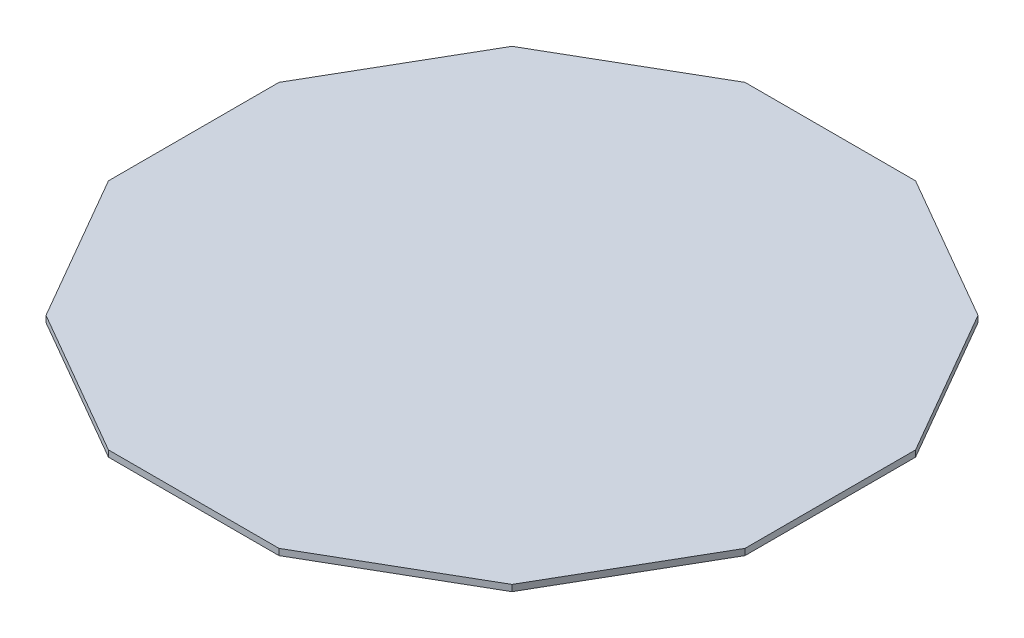
ISO-10303-21;
HEADER;
FILE_DESCRIPTION(('STEP AP214'),'2;1');
FILE_NAME('part.step','',(''),(''),'','','');
FILE_SCHEMA(('AUTOMOTIVE_DESIGN { 1 0 10303 214 1 1 1 1 }'));
ENDSEC;
DATA;
#1=APPLICATION_CONTEXT('core data for automotive mechanical design processes');
#2=APPLICATION_PROTOCOL_DEFINITION('international standard','automotive_design',2000,#1);
#3=PRODUCT_CONTEXT('',#1,'mechanical');
#4=PRODUCT('Part','Part','',(#3));
#5=PRODUCT_RELATED_PRODUCT_CATEGORY('part','',(#4));
#6=PRODUCT_DEFINITION_FORMATION('','',#4);
#7=PRODUCT_DEFINITION_CONTEXT('part definition',#1,'design');
#8=PRODUCT_DEFINITION('design','',#6,#7);
#9=PRODUCT_DEFINITION_SHAPE('','',#8);
#10=(LENGTH_UNIT() NAMED_UNIT(*) SI_UNIT(.MILLI.,.METRE.));
#11=(NAMED_UNIT(*) PLANE_ANGLE_UNIT() SI_UNIT($,.RADIAN.));
#12=(NAMED_UNIT(*) SI_UNIT($,.STERADIAN.) SOLID_ANGLE_UNIT());
#13=UNCERTAINTY_MEASURE_WITH_UNIT(LENGTH_MEASURE(1.E-05),#10,'distance_accuracy_value','');
#14=(GEOMETRIC_REPRESENTATION_CONTEXT(3) GLOBAL_UNCERTAINTY_ASSIGNED_CONTEXT((#13)) GLOBAL_UNIT_ASSIGNED_CONTEXT((#10,
#11,#12)) REPRESENTATION_CONTEXT('',''));
#15=CARTESIAN_POINT('',(0.,0.,0.));
#16=DIRECTION('',(0.,0.,1.));
#17=DIRECTION('',(1.,0.,0.));
#18=AXIS2_PLACEMENT_3D('',#15,#16,#17);
#19=CARTESIAN_POINT('',(127.485084689642,-2.921,-73.6035479632271));
#20=DIRECTION('',(0.866025403784439,0.,-0.5));
#21=DIRECTION('',(-0.5,0.,-0.866025403784439));
#22=AXIS2_PLACEMENT_3D('',#19,#20,#21);
#23=PLANE('',#22);
#24=DIRECTION('',(-0.5,0.,-0.866025403784439));
#25=VECTOR('',#24,1.);
#26=CARTESIAN_POINT('',(127.485084689642,0.,-73.6035479632271));
#27=LINE('',#26,#25);
#28=CARTESIAN_POINT('',(147.207095926454,0.,-39.4440224736242));
#29=VERTEX_POINT('',#28);
#30=CARTESIAN_POINT('',(107.76307345283,0.,-107.76307345283));
#31=VERTEX_POINT('',#30);
#32=EDGE_CURVE('E159',#29,#31,#27,.T.);
#33=ORIENTED_EDGE('',*,*,#32,.F.);
#34=DIRECTION('',(0.,1.,0.));
#35=VECTOR('',#34,1.);
#36=CARTESIAN_POINT('',(147.207095926454,-2.921,-39.4440224736242));
#37=LINE('',#36,#35);
#38=CARTESIAN_POINT('',(147.207095926454,-2.921,-39.4440224736242));
#39=VERTEX_POINT('',#38);
#40=EDGE_CURVE('E11',#39,#29,#37,.T.);
#41=ORIENTED_EDGE('',*,*,#40,.F.);
#42=DIRECTION('',(-0.5,0.,-0.866025403784439));
#43=VECTOR('',#42,1.);
#44=CARTESIAN_POINT('',(127.485084689642,-2.921,-73.6035479632271));
#45=LINE('',#44,#43);
#46=CARTESIAN_POINT('',(107.76307345283,-2.921,-107.76307345283));
#47=VERTEX_POINT('',#46);
#48=EDGE_CURVE('E191',#39,#47,#45,.T.);
#49=ORIENTED_EDGE('',*,*,#48,.T.);
#50=DIRECTION('',(0.,1.,0.));
#51=VECTOR('',#50,1.);
#52=CARTESIAN_POINT('',(107.76307345283,-2.921,-107.76307345283));
#53=LINE('',#52,#51);
#54=EDGE_CURVE('E41',#47,#31,#53,.T.);
#55=ORIENTED_EDGE('',*,*,#54,.T.);
#56=EDGE_LOOP('',(#33,#41,#49,#55));
#57=FACE_BOUND('',#56,.T.);
#58=ADVANCED_FACE('F38',(#57),#23,.T.);
#59=CARTESIAN_POINT('',(147.207095926454,-2.921,0.));
#60=DIRECTION('',(1.,0.,0.));
#61=DIRECTION('',(0.,0.,-1.));
#62=AXIS2_PLACEMENT_3D('',#59,#60,#61);
#63=PLANE('',#62);
#64=DIRECTION('',(0.,0.,-1.));
#65=VECTOR('',#64,1.);
#66=CARTESIAN_POINT('',(147.207095926454,0.,0.));
#67=LINE('',#66,#65);
#68=CARTESIAN_POINT('',(147.207095926454,0.,39.4440224736242));
#69=VERTEX_POINT('',#68);
#70=EDGE_CURVE('E189',#69,#29,#67,.T.);
#71=ORIENTED_EDGE('',*,*,#70,.F.);
#72=DIRECTION('',(0.,1.,0.));
#73=VECTOR('',#72,1.);
#74=CARTESIAN_POINT('',(147.207095926454,-2.921,39.4440224736242));
#75=LINE('',#74,#73);
#76=CARTESIAN_POINT('',(147.207095926454,-2.921,39.4440224736242));
#77=VERTEX_POINT('',#76);
#78=EDGE_CURVE('E47',#77,#69,#75,.T.);
#79=ORIENTED_EDGE('',*,*,#78,.F.);
#80=DIRECTION('',(0.,0.,-1.));
#81=VECTOR('',#80,1.);
#82=CARTESIAN_POINT('',(147.207095926454,-2.921,0.));
#83=LINE('',#82,#81);
#84=EDGE_CURVE('E149',#77,#39,#83,.T.);
#85=ORIENTED_EDGE('',*,*,#84,.T.);
#86=ORIENTED_EDGE('',*,*,#40,.T.);
#87=EDGE_LOOP('',(#71,#79,#85,#86));
#88=FACE_BOUND('',#87,.T.);
#89=ADVANCED_FACE('F211',(#88),#63,.T.);
#90=CARTESIAN_POINT('',(127.485084689642,-2.921,73.6035479632271));
#91=DIRECTION('',(0.866025403784439,0.,0.5));
#92=DIRECTION('',(0.5,0.,-0.866025403784439));
#93=AXIS2_PLACEMENT_3D('',#90,#91,#92);
#94=PLANE('',#93);
#95=DIRECTION('',(0.5,0.,-0.866025403784439));
#96=VECTOR('',#95,1.);
#97=CARTESIAN_POINT('',(127.485084689642,0.,73.6035479632271));
#98=LINE('',#97,#96);
#99=CARTESIAN_POINT('',(107.76307345283,0.,107.76307345283));
#100=VERTEX_POINT('',#99);
#101=EDGE_CURVE('E136',#100,#69,#98,.T.);
#102=ORIENTED_EDGE('',*,*,#101,.F.);
#103=DIRECTION('',(0.,1.,0.));
#104=VECTOR('',#103,1.);
#105=CARTESIAN_POINT('',(107.76307345283,-2.921,107.76307345283));
#106=LINE('',#105,#104);
#107=CARTESIAN_POINT('',(107.76307345283,-2.921,107.76307345283));
#108=VERTEX_POINT('',#107);
#109=EDGE_CURVE('E131',#108,#100,#106,.T.);
#110=ORIENTED_EDGE('',*,*,#109,.F.);
#111=DIRECTION('',(0.5,0.,-0.866025403784439));
#112=VECTOR('',#111,1.);
#113=CARTESIAN_POINT('',(127.485084689642,-2.921,73.6035479632271));
#114=LINE('',#113,#112);
#115=EDGE_CURVE('E134',#108,#77,#114,.T.);
#116=ORIENTED_EDGE('',*,*,#115,.T.);
#117=ORIENTED_EDGE('',*,*,#78,.T.);
#118=EDGE_LOOP('',(#102,#110,#116,#117));
#119=FACE_BOUND('',#118,.T.);
#120=ADVANCED_FACE('F133',(#119),#94,.T.);
#121=CARTESIAN_POINT('',(73.603547963227,-2.921,127.485084689642));
#122=DIRECTION('',(0.5,0.,0.866025403784439));
#123=DIRECTION('',(0.866025403784439,0.,-0.5));
#124=AXIS2_PLACEMENT_3D('',#121,#122,#123);
#125=PLANE('',#124);
#126=DIRECTION('',(0.866025403784439,0.,-0.5));
#127=VECTOR('',#126,1.);
#128=CARTESIAN_POINT('',(73.603547963227,0.,127.485084689642));
#129=LINE('',#128,#127);
#130=CARTESIAN_POINT('',(39.4440224736242,0.,147.207095926454));
#131=VERTEX_POINT('',#130);
#132=EDGE_CURVE('E186',#131,#100,#129,.T.);
#133=ORIENTED_EDGE('',*,*,#132,.F.);
#134=DIRECTION('',(0.,1.,0.));
#135=VECTOR('',#134,1.);
#136=CARTESIAN_POINT('',(39.4440224736242,-2.921,147.207095926454));
#137=LINE('',#136,#135);
#138=CARTESIAN_POINT('',(39.4440224736242,-2.921,147.207095926454));
#139=VERTEX_POINT('',#138);
#140=EDGE_CURVE('E141',#139,#131,#137,.T.);
#141=ORIENTED_EDGE('',*,*,#140,.F.);
#142=DIRECTION('',(0.866025403784439,0.,-0.5));
#143=VECTOR('',#142,1.);
#144=CARTESIAN_POINT('',(73.603547963227,-2.921,127.485084689642));
#145=LINE('',#144,#143);
#146=EDGE_CURVE('E147',#139,#108,#145,.T.);
#147=ORIENTED_EDGE('',*,*,#146,.T.);
#148=ORIENTED_EDGE('',*,*,#109,.T.);
#149=EDGE_LOOP('',(#133,#141,#147,#148));
#150=FACE_BOUND('',#149,.T.);
#151=ADVANCED_FACE('F151',(#150),#125,.T.);
#152=CARTESIAN_POINT('',(0.,-2.921,147.207095926454));
#153=DIRECTION('',(0.,0.,1.));
#154=DIRECTION('',(1.,0.,0.));
#155=AXIS2_PLACEMENT_3D('',#152,#153,#154);
#156=PLANE('',#155);
#157=DIRECTION('',(1.,0.,0.));
#158=VECTOR('',#157,1.);
#159=CARTESIAN_POINT('',(0.,0.,147.207095926454));
#160=LINE('',#159,#158);
#161=CARTESIAN_POINT('',(-39.4440224736242,0.,147.207095926454));
#162=VERTEX_POINT('',#161);
#163=EDGE_CURVE('E183',#162,#131,#160,.T.);
#164=ORIENTED_EDGE('',*,*,#163,.F.);
#165=DIRECTION('',(0.,1.,0.));
#166=VECTOR('',#165,1.);
#167=CARTESIAN_POINT('',(-39.4440224736242,-2.921,147.207095926454));
#168=LINE('',#167,#166);
#169=CARTESIAN_POINT('',(-39.4440224736242,-2.921,147.207095926454));
#170=VERTEX_POINT('',#169);
#171=EDGE_CURVE('E195',#170,#162,#168,.T.);
#172=ORIENTED_EDGE('',*,*,#171,.F.);
#173=DIRECTION('',(1.,0.,0.));
#174=VECTOR('',#173,1.);
#175=CARTESIAN_POINT('',(0.,-2.921,147.207095926454));
#176=LINE('',#175,#174);
#177=EDGE_CURVE('E152',#170,#139,#176,.T.);
#178=ORIENTED_EDGE('',*,*,#177,.T.);
#179=ORIENTED_EDGE('',*,*,#140,.T.);
#180=EDGE_LOOP('',(#164,#172,#178,#179));
#181=FACE_BOUND('',#180,.T.);
#182=ADVANCED_FACE('F224',(#181),#156,.T.);
#183=CARTESIAN_POINT('',(-73.603547963227,-2.921,127.485084689642));
#184=DIRECTION('',(-0.5,0.,0.866025403784439));
#185=DIRECTION('',(0.866025403784439,0.,0.5));
#186=AXIS2_PLACEMENT_3D('',#183,#184,#185);
#187=PLANE('',#186);
#188=DIRECTION('',(0.866025403784439,0.,0.5));
#189=VECTOR('',#188,1.);
#190=CARTESIAN_POINT('',(-73.603547963227,0.,127.485084689642));
#191=LINE('',#190,#189);
#192=CARTESIAN_POINT('',(-107.76307345283,0.,107.76307345283));
#193=VERTEX_POINT('',#192);
#194=EDGE_CURVE('E180',#193,#162,#191,.T.);
#195=ORIENTED_EDGE('',*,*,#194,.F.);
#196=DIRECTION('',(0.,1.,0.));
#197=VECTOR('',#196,1.);
#198=CARTESIAN_POINT('',(-107.76307345283,-2.921,107.76307345283));
#199=LINE('',#198,#197);
#200=CARTESIAN_POINT('',(-107.76307345283,-2.921,107.76307345283));
#201=VERTEX_POINT('',#200);
#202=EDGE_CURVE('E197',#201,#193,#199,.T.);
#203=ORIENTED_EDGE('',*,*,#202,.F.);
#204=DIRECTION('',(0.866025403784439,0.,0.5));
#205=VECTOR('',#204,1.);
#206=CARTESIAN_POINT('',(-73.603547963227,-2.921,127.485084689642));
#207=LINE('',#206,#205);
#208=EDGE_CURVE('E154',#201,#170,#207,.T.);
#209=ORIENTED_EDGE('',*,*,#208,.T.);
#210=ORIENTED_EDGE('',*,*,#171,.T.);
#211=EDGE_LOOP('',(#195,#203,#209,#210));
#212=FACE_BOUND('',#211,.T.);
#213=ADVANCED_FACE('F227',(#212),#187,.T.);
#214=CARTESIAN_POINT('',(-127.485084689642,-2.921,73.6035479632271));
#215=DIRECTION('',(-0.866025403784439,0.,0.5));
#216=DIRECTION('',(0.5,0.,0.866025403784439));
#217=AXIS2_PLACEMENT_3D('',#214,#215,#216);
#218=PLANE('',#217);
#219=DIRECTION('',(0.5,0.,0.866025403784439));
#220=VECTOR('',#219,1.);
#221=CARTESIAN_POINT('',(-127.485084689642,0.,73.6035479632271));
#222=LINE('',#221,#220);
#223=CARTESIAN_POINT('',(-147.207095926454,0.,39.4440224736242));
#224=VERTEX_POINT('',#223);
#225=EDGE_CURVE('E177',#224,#193,#222,.T.);
#226=ORIENTED_EDGE('',*,*,#225,.F.);
#227=DIRECTION('',(0.,1.,0.));
#228=VECTOR('',#227,1.);
#229=CARTESIAN_POINT('',(-147.207095926454,-2.921,39.4440224736242));
#230=LINE('',#229,#228);
#231=CARTESIAN_POINT('',(-147.207095926454,-2.921,39.4440224736242));
#232=VERTEX_POINT('',#231);
#233=EDGE_CURVE('E199',#232,#224,#230,.T.);
#234=ORIENTED_EDGE('',*,*,#233,.F.);
#235=DIRECTION('',(0.5,0.,0.866025403784439));
#236=VECTOR('',#235,1.);
#237=CARTESIAN_POINT('',(-127.485084689642,-2.921,73.6035479632271));
#238=LINE('',#237,#236);
#239=EDGE_CURVE('E353',#232,#201,#238,.T.);
#240=ORIENTED_EDGE('',*,*,#239,.T.);
#241=ORIENTED_EDGE('',*,*,#202,.T.);
#242=EDGE_LOOP('',(#226,#234,#240,#241));
#243=FACE_BOUND('',#242,.T.);
#244=ADVANCED_FACE('F231',(#243),#218,.T.);
#245=CARTESIAN_POINT('',(-147.207095926454,-2.921,0.));
#246=DIRECTION('',(-1.,0.,0.));
#247=DIRECTION('',(0.,0.,1.));
#248=AXIS2_PLACEMENT_3D('',#245,#246,#247);
#249=PLANE('',#248);
#250=DIRECTION('',(0.,0.,1.));
#251=VECTOR('',#250,1.);
#252=CARTESIAN_POINT('',(-147.207095926454,0.,0.));
#253=LINE('',#252,#251);
#254=CARTESIAN_POINT('',(-147.207095926454,0.,-39.4440224736242));
#255=VERTEX_POINT('',#254);
#256=EDGE_CURVE('E174',#255,#224,#253,.T.);
#257=ORIENTED_EDGE('',*,*,#256,.F.);
#258=DIRECTION('',(0.,1.,0.));
#259=VECTOR('',#258,1.);
#260=CARTESIAN_POINT('',(-147.207095926454,-2.921,-39.4440224736242));
#261=LINE('',#260,#259);
#262=CARTESIAN_POINT('',(-147.207095926454,-2.921,-39.4440224736242));
#263=VERTEX_POINT('',#262);
#264=EDGE_CURVE('E201',#263,#255,#261,.T.);
#265=ORIENTED_EDGE('',*,*,#264,.F.);
#266=DIRECTION('',(0.,0.,1.));
#267=VECTOR('',#266,1.);
#268=CARTESIAN_POINT('',(-147.207095926454,-2.921,0.));
#269=LINE('',#268,#267);
#270=EDGE_CURVE('E357',#263,#232,#269,.T.);
#271=ORIENTED_EDGE('',*,*,#270,.T.);
#272=ORIENTED_EDGE('',*,*,#233,.T.);
#273=EDGE_LOOP('',(#257,#265,#271,#272));
#274=FACE_BOUND('',#273,.T.);
#275=ADVANCED_FACE('F235',(#274),#249,.T.);
#276=CARTESIAN_POINT('',(-127.485084689642,-2.921,-73.603547963227));
#277=DIRECTION('',(-0.866025403784439,0.,-0.5));
#278=DIRECTION('',(-0.5,0.,0.866025403784439));
#279=AXIS2_PLACEMENT_3D('',#276,#277,#278);
#280=PLANE('',#279);
#281=DIRECTION('',(-0.5,0.,0.866025403784439));
#282=VECTOR('',#281,1.);
#283=CARTESIAN_POINT('',(-127.485084689642,0.,-73.603547963227));
#284=LINE('',#283,#282);
#285=CARTESIAN_POINT('',(-107.76307345283,0.,-107.76307345283));
#286=VERTEX_POINT('',#285);
#287=EDGE_CURVE('E171',#286,#255,#284,.T.);
#288=ORIENTED_EDGE('',*,*,#287,.F.);
#289=DIRECTION('',(0.,1.,0.));
#290=VECTOR('',#289,1.);
#291=CARTESIAN_POINT('',(-107.76307345283,-2.921,-107.76307345283));
#292=LINE('',#291,#290);
#293=CARTESIAN_POINT('',(-107.76307345283,-2.921,-107.76307345283));
#294=VERTEX_POINT('',#293);
#295=EDGE_CURVE('E203',#294,#286,#292,.T.);
#296=ORIENTED_EDGE('',*,*,#295,.F.);
#297=DIRECTION('',(-0.5,0.,0.866025403784439));
#298=VECTOR('',#297,1.);
#299=CARTESIAN_POINT('',(-127.485084689642,-2.921,-73.603547963227));
#300=LINE('',#299,#298);
#301=EDGE_CURVE('E346',#294,#263,#300,.T.);
#302=ORIENTED_EDGE('',*,*,#301,.T.);
#303=ORIENTED_EDGE('',*,*,#264,.T.);
#304=EDGE_LOOP('',(#288,#296,#302,#303));
#305=FACE_BOUND('',#304,.T.);
#306=ADVANCED_FACE('F239',(#305),#280,.T.);
#307=CARTESIAN_POINT('',(-73.603547963227,-2.921,-127.485084689642));
#308=DIRECTION('',(-0.5,0.,-0.866025403784439));
#309=DIRECTION('',(-0.866025403784439,0.,0.5));
#310=AXIS2_PLACEMENT_3D('',#307,#308,#309);
#311=PLANE('',#310);
#312=DIRECTION('',(-0.866025403784439,0.,0.5));
#313=VECTOR('',#312,1.);
#314=CARTESIAN_POINT('',(-73.603547963227,0.,-127.485084689642));
#315=LINE('',#314,#313);
#316=CARTESIAN_POINT('',(-39.4440224736242,0.,-147.207095926454));
#317=VERTEX_POINT('',#316);
#318=EDGE_CURVE('E168',#317,#286,#315,.T.);
#319=ORIENTED_EDGE('',*,*,#318,.F.);
#320=DIRECTION('',(0.,1.,0.));
#321=VECTOR('',#320,1.);
#322=CARTESIAN_POINT('',(-39.4440224736242,-2.921,-147.207095926454));
#323=LINE('',#322,#321);
#324=CARTESIAN_POINT('',(-39.4440224736242,-2.921,-147.207095926454));
#325=VERTEX_POINT('',#324);
#326=EDGE_CURVE('E205',#325,#317,#323,.T.);
#327=ORIENTED_EDGE('',*,*,#326,.F.);
#328=DIRECTION('',(-0.866025403784439,0.,0.5));
#329=VECTOR('',#328,1.);
#330=CARTESIAN_POINT('',(-73.603547963227,-2.921,-127.485084689642));
#331=LINE('',#330,#329);
#332=EDGE_CURVE('E342',#325,#294,#331,.T.);
#333=ORIENTED_EDGE('',*,*,#332,.T.);
#334=ORIENTED_EDGE('',*,*,#295,.T.);
#335=EDGE_LOOP('',(#319,#327,#333,#334));
#336=FACE_BOUND('',#335,.T.);
#337=ADVANCED_FACE('F243',(#336),#311,.T.);
#338=CARTESIAN_POINT('',(0.,-2.921,-147.207095926454));
#339=DIRECTION('',(0.,0.,-1.));
#340=DIRECTION('',(-1.,0.,0.));
#341=AXIS2_PLACEMENT_3D('',#338,#339,#340);
#342=PLANE('',#341);
#343=DIRECTION('',(-1.,0.,0.));
#344=VECTOR('',#343,1.);
#345=CARTESIAN_POINT('',(0.,0.,-147.207095926454));
#346=LINE('',#345,#344);
#347=CARTESIAN_POINT('',(39.4440224736242,0.,-147.207095926454));
#348=VERTEX_POINT('',#347);
#349=EDGE_CURVE('E165',#348,#317,#346,.T.);
#350=ORIENTED_EDGE('',*,*,#349,.F.);
#351=DIRECTION('',(0.,1.,0.));
#352=VECTOR('',#351,1.);
#353=CARTESIAN_POINT('',(39.4440224736242,-2.921,-147.207095926454));
#354=LINE('',#353,#352);
#355=CARTESIAN_POINT('',(39.4440224736242,-2.921,-147.207095926454));
#356=VERTEX_POINT('',#355);
#357=EDGE_CURVE('E206',#356,#348,#354,.T.);
#358=ORIENTED_EDGE('',*,*,#357,.F.);
#359=DIRECTION('',(-1.,0.,0.));
#360=VECTOR('',#359,1.);
#361=CARTESIAN_POINT('',(0.,-2.921,-147.207095926454));
#362=LINE('',#361,#360);
#363=EDGE_CURVE('E363',#356,#325,#362,.T.);
#364=ORIENTED_EDGE('',*,*,#363,.T.);
#365=ORIENTED_EDGE('',*,*,#326,.T.);
#366=EDGE_LOOP('',(#350,#358,#364,#365));
#367=FACE_BOUND('',#366,.T.);
#368=ADVANCED_FACE('F247',(#367),#342,.T.);
#369=CARTESIAN_POINT('',(73.603547963227,-2.921,-127.485084689642));
#370=DIRECTION('',(0.5,0.,-0.866025403784439));
#371=DIRECTION('',(-0.866025403784439,0.,-0.5));
#372=AXIS2_PLACEMENT_3D('',#369,#370,#371);
#373=PLANE('',#372);
#374=DIRECTION('',(-0.866025403784439,0.,-0.5));
#375=VECTOR('',#374,1.);
#376=CARTESIAN_POINT('',(73.603547963227,0.,-127.485084689642));
#377=LINE('',#376,#375);
#378=EDGE_CURVE('E162',#31,#348,#377,.T.);
#379=ORIENTED_EDGE('',*,*,#378,.F.);
#380=ORIENTED_EDGE('',*,*,#54,.F.);
#381=DIRECTION('',(-0.866025403784439,0.,-0.5));
#382=VECTOR('',#381,1.);
#383=CARTESIAN_POINT('',(73.603547963227,-2.921,-127.485084689642));
#384=LINE('',#383,#382);
#385=EDGE_CURVE('E365',#47,#356,#384,.T.);
#386=ORIENTED_EDGE('',*,*,#385,.T.);
#387=ORIENTED_EDGE('',*,*,#357,.T.);
#388=EDGE_LOOP('',(#379,#380,#386,#387));
#389=FACE_BOUND('',#388,.T.);
#390=ADVANCED_FACE('F208',(#389),#373,.T.);
#391=CARTESIAN_POINT('',(0.,-2.921,0.));
#392=DIRECTION('',(0.,1.,0.));
#393=DIRECTION('',(0.,0.,1.));
#394=AXIS2_PLACEMENT_3D('',#391,#392,#393);
#395=PLANE('',#394);
#396=ORIENTED_EDGE('',*,*,#48,.F.);
#397=ORIENTED_EDGE('',*,*,#84,.F.);
#398=ORIENTED_EDGE('',*,*,#115,.F.);
#399=ORIENTED_EDGE('',*,*,#146,.F.);
#400=ORIENTED_EDGE('',*,*,#177,.F.);
#401=ORIENTED_EDGE('',*,*,#208,.F.);
#402=ORIENTED_EDGE('',*,*,#239,.F.);
#403=ORIENTED_EDGE('',*,*,#270,.F.);
#404=ORIENTED_EDGE('',*,*,#301,.F.);
#405=ORIENTED_EDGE('',*,*,#332,.F.);
#406=ORIENTED_EDGE('',*,*,#363,.F.);
#407=ORIENTED_EDGE('',*,*,#385,.F.);
#408=EDGE_LOOP('',(#396,#397,#398,#399,#400,#401,#402,#403,#404,#405,#406,#407));
#409=FACE_BOUND('',#408,.T.);
#410=ADVANCED_FACE('F145',(#409),#395,.F.);
#411=CARTESIAN_POINT('',(0.,0.,0.));
#412=DIRECTION('',(0.,1.,0.));
#413=DIRECTION('',(0.,0.,1.));
#414=AXIS2_PLACEMENT_3D('',#411,#412,#413);
#415=PLANE('',#414);
#416=ORIENTED_EDGE('',*,*,#32,.T.);
#417=ORIENTED_EDGE('',*,*,#378,.T.);
#418=ORIENTED_EDGE('',*,*,#349,.T.);
#419=ORIENTED_EDGE('',*,*,#318,.T.);
#420=ORIENTED_EDGE('',*,*,#287,.T.);
#421=ORIENTED_EDGE('',*,*,#256,.T.);
#422=ORIENTED_EDGE('',*,*,#225,.T.);
#423=ORIENTED_EDGE('',*,*,#194,.T.);
#424=ORIENTED_EDGE('',*,*,#163,.T.);
#425=ORIENTED_EDGE('',*,*,#132,.T.);
#426=ORIENTED_EDGE('',*,*,#101,.T.);
#427=ORIENTED_EDGE('',*,*,#70,.T.);
#428=EDGE_LOOP('',(#416,#417,#418,#419,#420,#421,#422,#423,#424,#425,#426,#427));
#429=FACE_BOUND('',#428,.T.);
#430=ADVANCED_FACE('F210',(#429),#415,.T.);
#431=CLOSED_SHELL('',(#58,#89,#120,#151,#182,#213,#244,#275,#306,#337,#368,#390,#410,#430));
#432=MANIFOLD_SOLID_BREP('B2',#431);
#433=ADVANCED_BREP_SHAPE_REPRESENTATION('',(#18,#432),#14);
#434=SHAPE_DEFINITION_REPRESENTATION(#9,#433);
ENDSEC;
END-ISO-10303-21;
